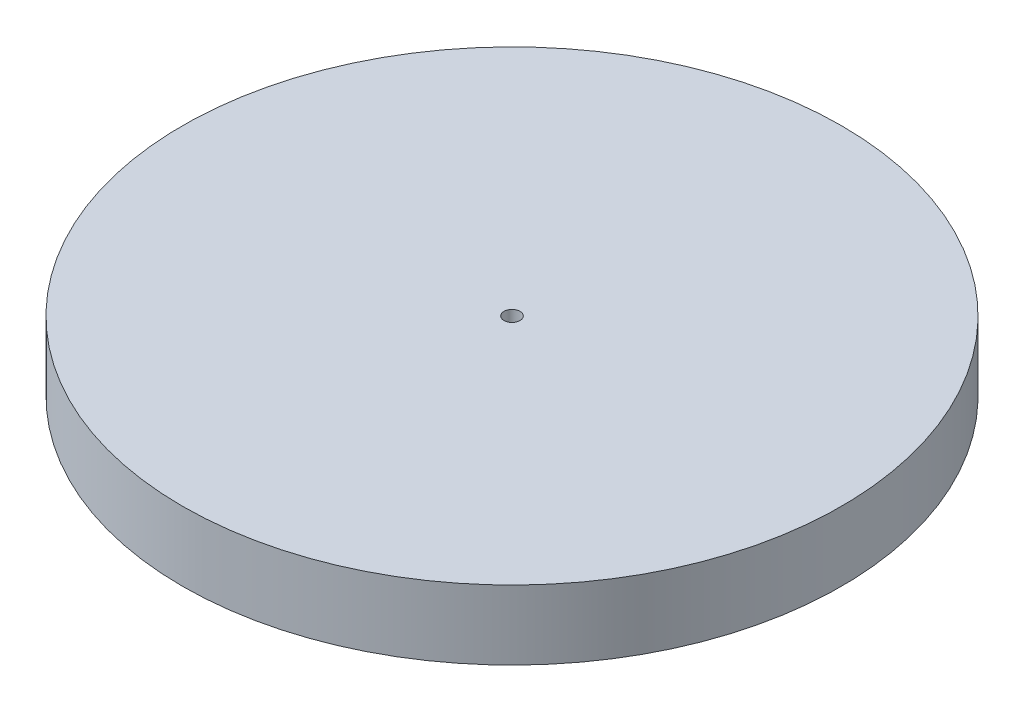
ISO-10303-21;
HEADER;
FILE_DESCRIPTION(('STEP AP214'),'2;1');
FILE_NAME('part.step','',(''),(''),'','','');
FILE_SCHEMA(('AUTOMOTIVE_DESIGN { 1 0 10303 214 1 1 1 1 }'));
ENDSEC;
DATA;
#1=APPLICATION_CONTEXT('core data for automotive mechanical design processes');
#2=APPLICATION_PROTOCOL_DEFINITION('international standard','automotive_design',2000,#1);
#3=PRODUCT_CONTEXT('',#1,'mechanical');
#4=PRODUCT('Part','Part','',(#3));
#5=PRODUCT_RELATED_PRODUCT_CATEGORY('part','',(#4));
#6=PRODUCT_DEFINITION_FORMATION('','',#4);
#7=PRODUCT_DEFINITION_CONTEXT('part definition',#1,'design');
#8=PRODUCT_DEFINITION('design','',#6,#7);
#9=PRODUCT_DEFINITION_SHAPE('','',#8);
#10=(LENGTH_UNIT() NAMED_UNIT(*) SI_UNIT(.MILLI.,.METRE.));
#11=(NAMED_UNIT(*) PLANE_ANGLE_UNIT() SI_UNIT($,.RADIAN.));
#12=(NAMED_UNIT(*) SI_UNIT($,.STERADIAN.) SOLID_ANGLE_UNIT());
#13=UNCERTAINTY_MEASURE_WITH_UNIT(LENGTH_MEASURE(1.E-05),#10,'distance_accuracy_value','');
#14=(GEOMETRIC_REPRESENTATION_CONTEXT(3) GLOBAL_UNCERTAINTY_ASSIGNED_CONTEXT((#13)) GLOBAL_UNIT_ASSIGNED_CONTEXT((#10,
#11,#12)) REPRESENTATION_CONTEXT('',''));
#15=CARTESIAN_POINT('',(0.,0.,0.));
#16=DIRECTION('',(0.,0.,1.));
#17=DIRECTION('',(1.,0.,0.));
#18=AXIS2_PLACEMENT_3D('',#15,#16,#17);
#19=CARTESIAN_POINT('',(0.,9.1,0.));
#20=DIRECTION('',(0.,1.,0.));
#21=DIRECTION('',(0.,0.,1.));
#22=AXIS2_PLACEMENT_3D('',#19,#20,#21);
#23=PLANE('',#22);
#24=CARTESIAN_POINT('',(0.,9.1,0.));
#25=DIRECTION('',(0.,1.,0.));
#26=DIRECTION('',(0.,0.,1.));
#27=AXIS2_PLACEMENT_3D('',#24,#25,#26);
#28=CIRCLE('',#27,43.25);
#29=CARTESIAN_POINT('',(0.,9.1,43.25));
#30=VERTEX_POINT('',#29);
#31=EDGE_CURVE('E10',#30,#30,#28,.T.);
#32=ORIENTED_EDGE('',*,*,#31,.T.);
#33=EDGE_LOOP('',(#32));
#34=FACE_BOUND('',#33,.T.);
#35=CARTESIAN_POINT('',(0.,9.1,0.));
#36=DIRECTION('',(0.,1.,0.));
#37=DIRECTION('',(0.,0.,1.));
#38=AXIS2_PLACEMENT_3D('',#35,#36,#37);
#39=CIRCLE('',#38,1.05);
#40=CARTESIAN_POINT('',(0.,9.1,1.05));
#41=VERTEX_POINT('',#40);
#42=EDGE_CURVE('E53',#41,#41,#39,.T.);
#43=ORIENTED_EDGE('',*,*,#42,.F.);
#44=EDGE_LOOP('',(#43));
#45=FACE_BOUND('',#44,.T.);
#46=ADVANCED_FACE('F40',(#34,#45),#23,.T.);
#47=CARTESIAN_POINT('',(0.,0.,0.));
#48=DIRECTION('',(0.,1.,0.));
#49=DIRECTION('',(0.,0.,1.));
#50=AXIS2_PLACEMENT_3D('',#47,#48,#49);
#51=PLANE('',#50);
#52=CARTESIAN_POINT('',(0.,0.,0.));
#53=DIRECTION('',(0.,1.,0.));
#54=DIRECTION('',(0.,0.,1.));
#55=AXIS2_PLACEMENT_3D('',#52,#53,#54);
#56=CIRCLE('',#55,43.25);
#57=CARTESIAN_POINT('',(0.,0.,43.25));
#58=VERTEX_POINT('',#57);
#59=EDGE_CURVE('E44',#58,#58,#56,.T.);
#60=ORIENTED_EDGE('',*,*,#59,.F.);
#61=EDGE_LOOP('',(#60));
#62=FACE_BOUND('',#61,.T.);
#63=CARTESIAN_POINT('',(0.,0.,0.));
#64=DIRECTION('',(0.,1.,0.));
#65=DIRECTION('',(0.,0.,1.));
#66=AXIS2_PLACEMENT_3D('',#63,#64,#65);
#67=CIRCLE('',#66,1.05);
#68=CARTESIAN_POINT('',(0.,0.,1.05));
#69=VERTEX_POINT('',#68);
#70=EDGE_CURVE('E55',#69,#69,#67,.T.);
#71=ORIENTED_EDGE('',*,*,#70,.T.);
#72=EDGE_LOOP('',(#71));
#73=FACE_BOUND('',#72,.T.);
#74=ADVANCED_FACE('F67',(#62,#73),#51,.F.);
#75=CARTESIAN_POINT('',(0.,9.1,0.));
#76=DIRECTION('',(0.,-1.,0.));
#77=DIRECTION('',(0.,0.,-1.));
#78=AXIS2_PLACEMENT_3D('',#75,#76,#77);
#79=CYLINDRICAL_SURFACE('',#78,43.25);
#80=ORIENTED_EDGE('',*,*,#31,.F.);
#81=EDGE_LOOP('',(#80));
#82=FACE_BOUND('',#81,.T.);
#83=ORIENTED_EDGE('',*,*,#59,.T.);
#84=EDGE_LOOP('',(#83));
#85=FACE_BOUND('',#84,.T.);
#86=ADVANCED_FACE('F42',(#82,#85),#79,.T.);
#87=CARTESIAN_POINT('',(0.,9.1,0.));
#88=DIRECTION('',(0.,-1.,0.));
#89=DIRECTION('',(0.,0.,-1.));
#90=AXIS2_PLACEMENT_3D('',#87,#88,#89);
#91=CYLINDRICAL_SURFACE('',#90,1.05);
#92=ORIENTED_EDGE('',*,*,#42,.T.);
#93=EDGE_LOOP('',(#92));
#94=FACE_BOUND('',#93,.T.);
#95=ORIENTED_EDGE('',*,*,#70,.F.);
#96=EDGE_LOOP('',(#95));
#97=FACE_BOUND('',#96,.T.);
#98=ADVANCED_FACE('F63',(#94,#97),#91,.F.);
#99=CLOSED_SHELL('',(#46,#74,#86,#98));
#100=MANIFOLD_SOLID_BREP('B2',#99);
#101=ADVANCED_BREP_SHAPE_REPRESENTATION('',(#18,#100),#14);
#102=SHAPE_DEFINITION_REPRESENTATION(#9,#101);
ENDSEC;
END-ISO-10303-21;
